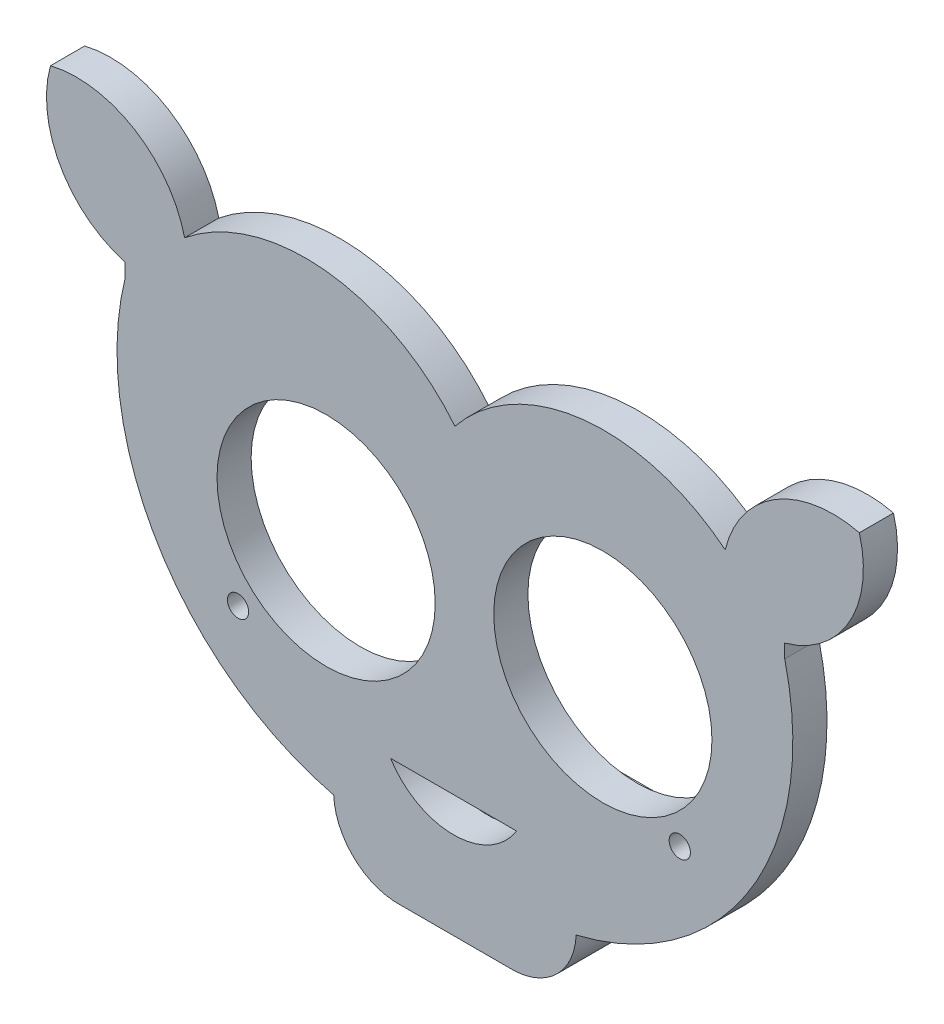
ISO-10303-21;
HEADER;
FILE_DESCRIPTION(('STEP AP214'),'2;1');
FILE_NAME('part.step','',(''),(''),'','','');
FILE_SCHEMA(('AUTOMOTIVE_DESIGN { 1 0 10303 214 1 1 1 1 }'));
ENDSEC;
DATA;
#1=APPLICATION_CONTEXT('core data for automotive mechanical design processes');
#2=APPLICATION_PROTOCOL_DEFINITION('international standard','automotive_design',2000,#1);
#3=PRODUCT_CONTEXT('',#1,'mechanical');
#4=PRODUCT('Part','Part','',(#3));
#5=PRODUCT_RELATED_PRODUCT_CATEGORY('part','',(#4));
#6=PRODUCT_DEFINITION_FORMATION('','',#4);
#7=PRODUCT_DEFINITION_CONTEXT('part definition',#1,'design');
#8=PRODUCT_DEFINITION('design','',#6,#7);
#9=PRODUCT_DEFINITION_SHAPE('','',#8);
#10=(LENGTH_UNIT() NAMED_UNIT(*) SI_UNIT(.MILLI.,.METRE.));
#11=(NAMED_UNIT(*) PLANE_ANGLE_UNIT() SI_UNIT($,.RADIAN.));
#12=(NAMED_UNIT(*) SI_UNIT($,.STERADIAN.) SOLID_ANGLE_UNIT());
#13=UNCERTAINTY_MEASURE_WITH_UNIT(LENGTH_MEASURE(1.E-05),#10,'distance_accuracy_value','');
#14=(GEOMETRIC_REPRESENTATION_CONTEXT(3) GLOBAL_UNCERTAINTY_ASSIGNED_CONTEXT((#13)) GLOBAL_UNIT_ASSIGNED_CONTEXT((#10,
#11,#12)) REPRESENTATION_CONTEXT('',''));
#15=CARTESIAN_POINT('',(0.,0.,0.));
#16=DIRECTION('',(0.,0.,1.));
#17=DIRECTION('',(1.,0.,0.));
#18=AXIS2_PLACEMENT_3D('',#15,#16,#17);
#19=CARTESIAN_POINT('',(38.3555523900781,3.96911641096236,0.));
#20=DIRECTION('',(0.,0.,1.));
#21=DIRECTION('',(1.,0.,0.));
#22=AXIS2_PLACEMENT_3D('',#19,#20,#21);
#23=PLANE('',#22);
#24=DIRECTION('',(-1.,0.,0.));
#25=VECTOR('',#24,1.);
#26=CARTESIAN_POINT('',(-19.2302630792207,-20.,0.));
#27=LINE('',#26,#25);
#28=CARTESIAN_POINT('',(37.0511121250854,-20.,0.));
#29=VERTEX_POINT('',#28);
#30=CARTESIAN_POINT('',(11.6300688555128,-20.,0.));
#31=VERTEX_POINT('',#30);
#32=EDGE_CURVE('E163',#29,#31,#27,.T.);
#33=ORIENTED_EDGE('',*,*,#32,.F.);
#34=CARTESIAN_POINT('',(29.3951473702594,5.56983304234548,0.));
#35=DIRECTION('',(0.,0.,1.));
#36=DIRECTION('',(1.,0.,0.));
#37=AXIS2_PLACEMENT_3D('',#34,#35,#36);
#38=CIRCLE('',#37,26.6913873401246);
#39=CARTESIAN_POINT('',(35.7289480452647,-20.3591686189192,0.));
#40=VERTEX_POINT('',#39);
#41=EDGE_CURVE('E217',#40,#29,#38,.T.);
#42=ORIENTED_EDGE('',*,*,#41,.F.);
#43=CARTESIAN_POINT('',(29.6583954974978,-20.0959204916808,0.));
#44=DIRECTION('',(0.,0.,1.));
#45=DIRECTION('',(-1.,0.,0.));
#46=AXIS2_PLACEMENT_3D('',#43,#44,#45);
#47=CIRCLE('',#46,6.07625771439082);
#48=CARTESIAN_POINT('',(29.3951473702594,-26.1664730394477,0.));
#49=VERTEX_POINT('',#48);
#50=EDGE_CURVE('E257',#49,#40,#47,.T.);
#51=ORIENTED_EDGE('',*,*,#50,.F.);
#52=DIRECTION('',(1.,0.,0.));
#53=VECTOR('',#52,1.);
#54=CARTESIAN_POINT('',(29.3951473702594,-26.1664730394477,0.));
#55=LINE('',#54,#53);
#56=CARTESIAN_POINT('',(19.2860336103388,-26.1664730394477,0.));
#57=VERTEX_POINT('',#56);
#58=EDGE_CURVE('E255',#57,#49,#55,.T.);
#59=ORIENTED_EDGE('',*,*,#58,.F.);
#60=CARTESIAN_POINT('',(19.0227854831005,-20.0959204916808,0.));
#61=DIRECTION('',(0.,0.,1.));
#62=DIRECTION('',(1.,0.,0.));
#63=AXIS2_PLACEMENT_3D('',#60,#61,#62);
#64=CIRCLE('',#63,6.07625771439082);
#65=CARTESIAN_POINT('',(12.9522329353335,-20.3591686189192,0.));
#66=VERTEX_POINT('',#65);
#67=EDGE_CURVE('E253',#66,#57,#64,.T.);
#68=ORIENTED_EDGE('',*,*,#67,.F.);
#69=CARTESIAN_POINT('',(19.2860336103388,5.56983304234548,0.));
#70=DIRECTION('',(0.,0.,1.));
#71=DIRECTION('',(-1.,0.,0.));
#72=AXIS2_PLACEMENT_3D('',#69,#70,#71);
#73=CIRCLE('',#72,26.6913873401246);
#74=EDGE_CURVE('E212',#31,#66,#73,.T.);
#75=ORIENTED_EDGE('',*,*,#74,.F.);
#76=EDGE_LOOP('',(#33,#42,#51,#59,#68,#75));
#77=FACE_BOUND('',#76,.T.);
#78=ADVANCED_FACE('F39',(#77),#23,.F.);
#79=CARTESIAN_POINT('',(38.3555523900781,3.96911641096236,15.));
#80=DIRECTION('',(0.,0.,-1.));
#81=DIRECTION('',(-1.,0.,0.));
#82=AXIS2_PLACEMENT_3D('',#79,#80,#81);
#83=CYLINDRICAL_SURFACE('',#82,18.0507581157901);
#84=DIRECTION('',(0.,0.,-1.));
#85=VECTOR('',#84,1.);
#86=CARTESIAN_POINT('',(49.7314352790014,17.9840783107417,15.));
#87=LINE('',#86,#85);
#88=CARTESIAN_POINT('',(49.7314352790014,17.9840783107417,15.));
#89=VERTEX_POINT('',#88);
#90=CARTESIAN_POINT('',(49.7314352790014,17.9840783107417,11.7916882033767));
#91=VERTEX_POINT('',#90);
#92=EDGE_CURVE('E251',#89,#91,#87,.T.);
#93=ORIENTED_EDGE('',*,*,#92,.T.);
#94=CARTESIAN_POINT('',(38.3555523900781,3.96911641096236,11.7916882033767));
#95=DIRECTION('',(0.,0.,1.));
#96=DIRECTION('',(1.,0.,0.));
#97=AXIS2_PLACEMENT_3D('',#94,#95,#96);
#98=CIRCLE('',#97,18.0507581157901);
#99=CARTESIAN_POINT('',(24.3405904902991,15.344999299886,11.7916882033767));
#100=VERTEX_POINT('',#99);
#101=EDGE_CURVE('E321',#91,#100,#98,.T.);
#102=ORIENTED_EDGE('',*,*,#101,.T.);
#103=DIRECTION('',(0.,0.,-1.));
#104=VECTOR('',#103,1.);
#105=CARTESIAN_POINT('',(24.3405904902991,15.344999299886,15.));
#106=LINE('',#105,#104);
#107=CARTESIAN_POINT('',(24.3405904902991,15.344999299886,15.));
#108=VERTEX_POINT('',#107);
#109=EDGE_CURVE('E11',#108,#100,#106,.T.);
#110=ORIENTED_EDGE('',*,*,#109,.F.);
#111=CARTESIAN_POINT('',(38.3555523900781,3.96911641096236,15.));
#112=DIRECTION('',(0.,0.,1.));
#113=DIRECTION('',(1.,0.,0.));
#114=AXIS2_PLACEMENT_3D('',#111,#112,#113);
#115=CIRCLE('',#114,18.0507581157901);
#116=EDGE_CURVE('E213',#89,#108,#115,.T.);
#117=ORIENTED_EDGE('',*,*,#116,.F.);
#118=EDGE_LOOP('',(#93,#102,#110,#117));
#119=FACE_BOUND('',#118,.T.);
#120=ADVANCED_FACE('F41',(#119),#83,.T.);
#121=CARTESIAN_POINT('',(10.3256285905201,3.96911641096236,15.));
#122=DIRECTION('',(0.,0.,-1.));
#123=DIRECTION('',(-1.,0.,0.));
#124=AXIS2_PLACEMENT_3D('',#121,#122,#123);
#125=CYLINDRICAL_SURFACE('',#124,18.0507581157901);
#126=ORIENTED_EDGE('',*,*,#109,.T.);
#127=CARTESIAN_POINT('',(10.3256285905201,3.96911641096236,11.7916882033767));
#128=DIRECTION('',(0.,0.,1.));
#129=DIRECTION('',(1.,0.,0.));
#130=AXIS2_PLACEMENT_3D('',#127,#128,#129);
#131=CIRCLE('',#130,18.0507581157901);
#132=CARTESIAN_POINT('',(-1.05025429840317,17.9840783107417,11.7916882033767));
#133=VERTEX_POINT('',#132);
#134=EDGE_CURVE('E324',#100,#133,#131,.T.);
#135=ORIENTED_EDGE('',*,*,#134,.T.);
#136=DIRECTION('',(0.,0.,-1.));
#137=VECTOR('',#136,1.);
#138=CARTESIAN_POINT('',(-1.05025429840317,17.9840783107417,15.));
#139=LINE('',#138,#137);
#140=CARTESIAN_POINT('',(-1.05025429840317,17.9840783107417,15.));
#141=VERTEX_POINT('',#140);
#142=EDGE_CURVE('E48',#141,#133,#139,.T.);
#143=ORIENTED_EDGE('',*,*,#142,.F.);
#144=CARTESIAN_POINT('',(10.3256285905201,3.96911641096236,15.));
#145=DIRECTION('',(0.,0.,1.));
#146=DIRECTION('',(-1.,0.,0.));
#147=AXIS2_PLACEMENT_3D('',#144,#145,#146);
#148=CIRCLE('',#147,18.0507581157901);
#149=EDGE_CURVE('E216',#108,#141,#148,.T.);
#150=ORIENTED_EDGE('',*,*,#149,.F.);
#151=EDGE_LOOP('',(#126,#135,#143,#150));
#152=FACE_BOUND('',#151,.T.);
#153=ADVANCED_FACE('F346',(#152),#125,.T.);
#154=CARTESIAN_POINT('',(-11.1993645312386,15.529105025536,15.));
#155=DIRECTION('',(0.,0.,-1.));
#156=DIRECTION('',(-1.,0.,0.));
#157=AXIS2_PLACEMENT_3D('',#154,#155,#156);
#158=CYLINDRICAL_SURFACE('',#157,10.4418069484797);
#159=ORIENTED_EDGE('',*,*,#142,.T.);
#160=CARTESIAN_POINT('',(-11.1993645312386,15.529105025536,11.7916882033767));
#161=DIRECTION('',(0.,0.,1.));
#162=DIRECTION('',(1.,0.,0.));
#163=AXIS2_PLACEMENT_3D('',#160,#161,#162);
#164=CIRCLE('',#163,10.4418069484797);
#165=CARTESIAN_POINT('',(-13.6543378164428,25.6782152583717,11.7916882033767));
#166=VERTEX_POINT('',#165);
#167=EDGE_CURVE('E327',#133,#166,#164,.T.);
#168=ORIENTED_EDGE('',*,*,#167,.T.);
#169=DIRECTION('',(0.,0.,-1.));
#170=VECTOR('',#169,1.);
#171=CARTESIAN_POINT('',(-13.6543378164428,25.6782152583717,15.));
#172=LINE('',#171,#170);
#173=CARTESIAN_POINT('',(-13.6543378164428,25.6782152583717,15.));
#174=VERTEX_POINT('',#173);
#175=EDGE_CURVE('E288',#174,#166,#172,.T.);
#176=ORIENTED_EDGE('',*,*,#175,.F.);
#177=CARTESIAN_POINT('',(-11.1993645312386,15.529105025536,15.));
#178=DIRECTION('',(0.,0.,1.));
#179=DIRECTION('',(-1.,0.,0.));
#180=AXIS2_PLACEMENT_3D('',#177,#178,#179);
#181=CIRCLE('',#180,10.4418069484797);
#182=EDGE_CURVE('E219',#141,#174,#181,.T.);
#183=ORIENTED_EDGE('',*,*,#182,.F.);
#184=EDGE_LOOP('',(#159,#168,#176,#183));
#185=FACE_BOUND('',#184,.T.);
#186=ADVANCED_FACE('F344',(#185),#158,.T.);
#187=CARTESIAN_POINT('',(-3.90661820989917,22.941865417345,15.));
#188=DIRECTION('',(0.,0.,-1.));
#189=DIRECTION('',(-1.,0.,0.));
#190=AXIS2_PLACEMENT_3D('',#187,#188,#189);
#191=CYLINDRICAL_SURFACE('',#190,10.1245072956802);
#192=ORIENTED_EDGE('',*,*,#175,.T.);
#193=CARTESIAN_POINT('',(-3.90661820989917,22.941865417345,11.7916882033767));
#194=DIRECTION('',(0.,0.,1.));
#195=DIRECTION('',(1.,0.,0.));
#196=AXIS2_PLACEMENT_3D('',#193,#194,#195);
#197=CIRCLE('',#196,10.1245072956802);
#198=CARTESIAN_POINT('',(-6.6429680509259,13.1941458108014,11.7916882033767));
#199=VERTEX_POINT('',#198);
#200=EDGE_CURVE('E185',#166,#199,#197,.T.);
#201=ORIENTED_EDGE('',*,*,#200,.T.);
#202=DIRECTION('',(0.,0.,-1.));
#203=VECTOR('',#202,1.);
#204=CARTESIAN_POINT('',(-6.6429680509259,13.1941458108014,15.));
#205=LINE('',#204,#203);
#206=CARTESIAN_POINT('',(-6.6429680509259,13.1941458108014,15.));
#207=VERTEX_POINT('',#206);
#208=EDGE_CURVE('E285',#207,#199,#205,.T.);
#209=ORIENTED_EDGE('',*,*,#208,.F.);
#210=CARTESIAN_POINT('',(-3.90661820989917,22.941865417345,15.));
#211=DIRECTION('',(0.,0.,1.));
#212=DIRECTION('',(-1.,0.,0.));
#213=AXIS2_PLACEMENT_3D('',#210,#211,#212);
#214=CIRCLE('',#213,10.1245072956802);
#215=EDGE_CURVE('E221',#174,#207,#214,.T.);
#216=ORIENTED_EDGE('',*,*,#215,.F.);
#217=EDGE_LOOP('',(#192,#201,#209,#216));
#218=FACE_BOUND('',#217,.T.);
#219=ADVANCED_FACE('F332',(#218),#191,.T.);
#220=CARTESIAN_POINT('',(-6.6429680509259,13.1941458108014,15.));
#221=DIRECTION('',(1.,0.,0.));
#222=DIRECTION('',(0.,0.,-1.));
#223=AXIS2_PLACEMENT_3D('',#220,#221,#222);
#224=PLANE('',#223);
#225=ORIENTED_EDGE('',*,*,#208,.T.);
#226=DIRECTION('',(0.,-1.,0.));
#227=VECTOR('',#226,1.);
#228=CARTESIAN_POINT('',(-6.6429680509259,13.1941458108014,11.7916882033767));
#229=LINE('',#228,#227);
#230=CARTESIAN_POINT('',(-6.6429680509259,11.9036337173506,11.7916882033767));
#231=VERTEX_POINT('',#230);
#232=EDGE_CURVE('E182',#199,#231,#229,.T.);
#233=ORIENTED_EDGE('',*,*,#232,.T.);
#234=DIRECTION('',(0.,0.,-1.));
#235=VECTOR('',#234,1.);
#236=CARTESIAN_POINT('',(-6.6429680509259,11.9036337173506,15.));
#237=LINE('',#236,#235);
#238=CARTESIAN_POINT('',(-6.6429680509259,11.9036337173506,15.));
#239=VERTEX_POINT('',#238);
#240=EDGE_CURVE('E181',#239,#231,#237,.T.);
#241=ORIENTED_EDGE('',*,*,#240,.F.);
#242=CARTESIAN_POINT('',(-6.6429680509259,13.1941458108014,15.));
#243=CARTESIAN_POINT('',(-6.6429680509259,11.9036337173506,15.));
#244=B_SPLINE_CURVE_WITH_KNOTS('',1,(#242,#243),.UNSPECIFIED.,.F.,.F.,(2,2),(0.,1.),.UNSPECIFIED.);
#245=EDGE_CURVE('E223',#207,#239,#244,.T.);
#246=ORIENTED_EDGE('',*,*,#245,.F.);
#247=EDGE_LOOP('',(#225,#233,#241,#246));
#248=FACE_BOUND('',#247,.T.);
#249=ADVANCED_FACE('F337',(#248),#224,.F.);
#250=CARTESIAN_POINT('',(19.2860336103388,5.56983304234548,15.));
#251=DIRECTION('',(0.,0.,-1.));
#252=DIRECTION('',(-1.,0.,0.));
#253=AXIS2_PLACEMENT_3D('',#250,#251,#252);
#254=CYLINDRICAL_SURFACE('',#253,26.6913873401246);
#255=ORIENTED_EDGE('',*,*,#240,.T.);
#256=CARTESIAN_POINT('',(19.2860336103388,5.56983304234548,11.7916882033767));
#257=DIRECTION('',(0.,0.,1.));
#258=DIRECTION('',(1.,0.,0.));
#259=AXIS2_PLACEMENT_3D('',#256,#257,#258);
#260=CIRCLE('',#259,26.6913873401246);
#261=CARTESIAN_POINT('',(11.6300688555128,-20.,11.7916882033767));
#262=VERTEX_POINT('',#261);
#263=EDGE_CURVE('E171',#231,#262,#260,.T.);
#264=ORIENTED_EDGE('',*,*,#263,.T.);
#265=DIRECTION('',(0.,0.,-1.));
#266=VECTOR('',#265,1.);
#267=CARTESIAN_POINT('',(11.6300688555128,-20.,15.));
#268=LINE('',#267,#266);
#269=EDGE_CURVE('E159',#31,#262,#268,.F.);
#270=ORIENTED_EDGE('',*,*,#269,.F.);
#271=ORIENTED_EDGE('',*,*,#74,.T.);
#272=DIRECTION('',(0.,0.,-1.));
#273=VECTOR('',#272,1.);
#274=CARTESIAN_POINT('',(12.9522329353335,-20.3591686189192,15.));
#275=LINE('',#274,#273);
#276=CARTESIAN_POINT('',(12.9522329353335,-20.3591686189192,15.));
#277=VERTEX_POINT('',#276);
#278=EDGE_CURVE('E281',#277,#66,#275,.T.);
#279=ORIENTED_EDGE('',*,*,#278,.F.);
#280=CARTESIAN_POINT('',(19.2860336103388,5.56983304234548,15.));
#281=DIRECTION('',(0.,0.,1.));
#282=DIRECTION('',(-1.,0.,0.));
#283=AXIS2_PLACEMENT_3D('',#280,#281,#282);
#284=CIRCLE('',#283,26.6913873401246);
#285=EDGE_CURVE('E227',#239,#277,#284,.T.);
#286=ORIENTED_EDGE('',*,*,#285,.F.);
#287=EDGE_LOOP('',(#255,#264,#270,#271,#279,#286));
#288=FACE_BOUND('',#287,.T.);
#289=ADVANCED_FACE('F178',(#288),#254,.T.);
#290=CARTESIAN_POINT('',(19.0227854831005,-20.0959204916808,15.));
#291=DIRECTION('',(0.,0.,-1.));
#292=DIRECTION('',(-1.,0.,0.));
#293=AXIS2_PLACEMENT_3D('',#290,#291,#292);
#294=CYLINDRICAL_SURFACE('',#293,6.07625771439082);
#295=ORIENTED_EDGE('',*,*,#67,.T.);
#296=DIRECTION('',(0.,0.,-1.));
#297=VECTOR('',#296,1.);
#298=CARTESIAN_POINT('',(19.2860336103388,-26.1664730394477,15.));
#299=LINE('',#298,#297);
#300=CARTESIAN_POINT('',(19.2860336103388,-26.1664730394477,15.));
#301=VERTEX_POINT('',#300);
#302=EDGE_CURVE('E278',#301,#57,#299,.T.);
#303=ORIENTED_EDGE('',*,*,#302,.F.);
#304=CARTESIAN_POINT('',(19.0227854831005,-20.0959204916808,15.));
#305=DIRECTION('',(0.,0.,1.));
#306=DIRECTION('',(1.,0.,0.));
#307=AXIS2_PLACEMENT_3D('',#304,#305,#306);
#308=CIRCLE('',#307,6.07625771439082);
#309=EDGE_CURVE('E232',#277,#301,#308,.T.);
#310=ORIENTED_EDGE('',*,*,#309,.F.);
#311=ORIENTED_EDGE('',*,*,#278,.T.);
#312=EDGE_LOOP('',(#295,#303,#310,#311));
#313=FACE_BOUND('',#312,.T.);
#314=ADVANCED_FACE('F374',(#313),#294,.T.);
#315=CARTESIAN_POINT('',(29.3951473702594,-26.1664730394477,15.));
#316=DIRECTION('',(0.,1.,0.));
#317=DIRECTION('',(0.,0.,1.));
#318=AXIS2_PLACEMENT_3D('',#315,#316,#317);
#319=PLANE('',#318);
#320=CARTESIAN_POINT('',(24.8310691421136,-26.1664730394477,5.82419793963385));
#321=DIRECTION('',(0.,1.,0.));
#322=DIRECTION('',(0.,0.,1.));
#323=AXIS2_PLACEMENT_3D('',#320,#321,#322);
#324=CIRCLE('',#323,1.5);
#325=CARTESIAN_POINT('',(24.8310691421136,-26.1664730394477,7.32419793963385));
#326=VERTEX_POINT('',#325);
#327=EDGE_CURVE('E175',#326,#326,#324,.T.);
#328=ORIENTED_EDGE('',*,*,#327,.T.);
#329=EDGE_LOOP('',(#328));
#330=FACE_BOUND('',#329,.T.);
#331=ORIENTED_EDGE('',*,*,#58,.T.);
#332=DIRECTION('',(0.,0.,-1.));
#333=VECTOR('',#332,1.);
#334=CARTESIAN_POINT('',(29.3951473702594,-26.1664730394477,15.));
#335=LINE('',#334,#333);
#336=CARTESIAN_POINT('',(29.3951473702594,-26.1664730394477,15.));
#337=VERTEX_POINT('',#336);
#338=EDGE_CURVE('E275',#337,#49,#335,.T.);
#339=ORIENTED_EDGE('',*,*,#338,.F.);
#340=DIRECTION('',(1.,0.,0.));
#341=VECTOR('',#340,1.);
#342=CARTESIAN_POINT('',(29.3951473702594,-26.1664730394477,15.));
#343=LINE('',#342,#341);
#344=EDGE_CURVE('E234',#301,#337,#343,.T.);
#345=ORIENTED_EDGE('',*,*,#344,.F.);
#346=ORIENTED_EDGE('',*,*,#302,.T.);
#347=EDGE_LOOP('',(#331,#339,#345,#346));
#348=FACE_BOUND('',#347,.T.);
#349=ADVANCED_FACE('F380',(#330,#348),#319,.F.);
#350=CARTESIAN_POINT('',(29.6583954974978,-20.0959204916808,15.));
#351=DIRECTION('',(0.,0.,-1.));
#352=DIRECTION('',(-1.,0.,0.));
#353=AXIS2_PLACEMENT_3D('',#350,#351,#352);
#354=CYLINDRICAL_SURFACE('',#353,6.07625771439082);
#355=ORIENTED_EDGE('',*,*,#50,.T.);
#356=DIRECTION('',(0.,0.,-1.));
#357=VECTOR('',#356,1.);
#358=CARTESIAN_POINT('',(35.7289480452647,-20.3591686189192,15.));
#359=LINE('',#358,#357);
#360=CARTESIAN_POINT('',(35.7289480452647,-20.3591686189192,15.));
#361=VERTEX_POINT('',#360);
#362=EDGE_CURVE('E272',#361,#40,#359,.T.);
#363=ORIENTED_EDGE('',*,*,#362,.F.);
#364=CARTESIAN_POINT('',(29.6583954974978,-20.0959204916808,15.));
#365=DIRECTION('',(0.,0.,1.));
#366=DIRECTION('',(-1.,0.,0.));
#367=AXIS2_PLACEMENT_3D('',#364,#365,#366);
#368=CIRCLE('',#367,6.07625771439082);
#369=EDGE_CURVE('E236',#337,#361,#368,.T.);
#370=ORIENTED_EDGE('',*,*,#369,.F.);
#371=ORIENTED_EDGE('',*,*,#338,.T.);
#372=EDGE_LOOP('',(#355,#363,#370,#371));
#373=FACE_BOUND('',#372,.T.);
#374=ADVANCED_FACE('F382',(#373),#354,.T.);
#375=CARTESIAN_POINT('',(29.3951473702594,5.56983304234548,15.));
#376=DIRECTION('',(0.,0.,-1.));
#377=DIRECTION('',(-1.,0.,0.));
#378=AXIS2_PLACEMENT_3D('',#375,#376,#377);
#379=CYLINDRICAL_SURFACE('',#378,26.6913873401246);
#380=DIRECTION('',(0.,0.,-1.));
#381=VECTOR('',#380,1.);
#382=CARTESIAN_POINT('',(37.0511121250854,-20.,15.));
#383=LINE('',#382,#381);
#384=CARTESIAN_POINT('',(37.0511121250854,-20.,11.7916882033767));
#385=VERTEX_POINT('',#384);
#386=EDGE_CURVE('E56',#385,#29,#383,.T.);
#387=ORIENTED_EDGE('',*,*,#386,.F.);
#388=CARTESIAN_POINT('',(29.3951473702594,5.56983304234548,11.7916882033767));
#389=DIRECTION('',(0.,0.,1.));
#390=DIRECTION('',(1.,0.,0.));
#391=AXIS2_PLACEMENT_3D('',#388,#389,#390);
#392=CIRCLE('',#391,26.6913873401246);
#393=CARTESIAN_POINT('',(55.3241490315241,11.9036337173506,11.7916882033767));
#394=VERTEX_POINT('',#393);
#395=EDGE_CURVE('E174',#385,#394,#392,.T.);
#396=ORIENTED_EDGE('',*,*,#395,.T.);
#397=DIRECTION('',(0.,0.,-1.));
#398=VECTOR('',#397,1.);
#399=CARTESIAN_POINT('',(55.3241490315241,11.9036337173506,15.));
#400=LINE('',#399,#398);
#401=CARTESIAN_POINT('',(55.3241490315241,11.9036337173506,15.));
#402=VERTEX_POINT('',#401);
#403=EDGE_CURVE('E269',#402,#394,#400,.T.);
#404=ORIENTED_EDGE('',*,*,#403,.F.);
#405=CARTESIAN_POINT('',(29.3951473702594,5.56983304234548,15.));
#406=DIRECTION('',(0.,0.,1.));
#407=DIRECTION('',(1.,0.,0.));
#408=AXIS2_PLACEMENT_3D('',#405,#406,#407);
#409=CIRCLE('',#408,26.6913873401246);
#410=EDGE_CURVE('E238',#361,#402,#409,.T.);
#411=ORIENTED_EDGE('',*,*,#410,.F.);
#412=ORIENTED_EDGE('',*,*,#362,.T.);
#413=ORIENTED_EDGE('',*,*,#41,.T.);
#414=EDGE_LOOP('',(#387,#396,#404,#411,#412,#413));
#415=FACE_BOUND('',#414,.T.);
#416=ADVANCED_FACE('F365',(#415),#379,.T.);
#417=CARTESIAN_POINT('',(55.3241490315241,11.9036337173506,15.));
#418=DIRECTION('',(-1.,0.,0.));
#419=DIRECTION('',(0.,0.,1.));
#420=AXIS2_PLACEMENT_3D('',#417,#418,#419);
#421=PLANE('',#420);
#422=ORIENTED_EDGE('',*,*,#403,.T.);
#423=DIRECTION('',(0.,1.,0.));
#424=VECTOR('',#423,1.);
#425=CARTESIAN_POINT('',(55.3241490315241,11.9036337173506,11.7916882033767));
#426=LINE('',#425,#424);
#427=CARTESIAN_POINT('',(55.3241490315241,13.1941458108014,11.7916882033767));
#428=VERTEX_POINT('',#427);
#429=EDGE_CURVE('E317',#394,#428,#426,.T.);
#430=ORIENTED_EDGE('',*,*,#429,.T.);
#431=DIRECTION('',(0.,0.,-1.));
#432=VECTOR('',#431,1.);
#433=CARTESIAN_POINT('',(55.3241490315241,13.1941458108014,15.));
#434=LINE('',#433,#432);
#435=CARTESIAN_POINT('',(55.3241490315241,13.1941458108014,15.));
#436=VERTEX_POINT('',#435);
#437=EDGE_CURVE('E266',#436,#428,#434,.T.);
#438=ORIENTED_EDGE('',*,*,#437,.F.);
#439=CARTESIAN_POINT('',(55.3241490315241,11.9036337173506,15.));
#440=CARTESIAN_POINT('',(55.3241490315241,13.1941458108014,15.));
#441=B_SPLINE_CURVE_WITH_KNOTS('',1,(#439,#440),.UNSPECIFIED.,.F.,.F.,(2,2),(0.,1.),.UNSPECIFIED.);
#442=EDGE_CURVE('E240',#402,#436,#441,.T.);
#443=ORIENTED_EDGE('',*,*,#442,.F.);
#444=EDGE_LOOP('',(#422,#430,#438,#443));
#445=FACE_BOUND('',#444,.T.);
#446=ADVANCED_FACE('F360',(#445),#421,.F.);
#447=CARTESIAN_POINT('',(52.5877991904974,22.941865417345,15.));
#448=DIRECTION('',(0.,0.,-1.));
#449=DIRECTION('',(-1.,0.,0.));
#450=AXIS2_PLACEMENT_3D('',#447,#448,#449);
#451=CYLINDRICAL_SURFACE('',#450,10.1245072956802);
#452=ORIENTED_EDGE('',*,*,#437,.T.);
#453=CARTESIAN_POINT('',(52.5877991904974,22.941865417345,11.7916882033767));
#454=DIRECTION('',(0.,0.,1.));
#455=DIRECTION('',(1.,0.,0.));
#456=AXIS2_PLACEMENT_3D('',#453,#454,#455);
#457=CIRCLE('',#456,10.1245072956802);
#458=CARTESIAN_POINT('',(62.335518797041,25.6782152583717,11.7916882033767));
#459=VERTEX_POINT('',#458);
#460=EDGE_CURVE('E314',#428,#459,#457,.T.);
#461=ORIENTED_EDGE('',*,*,#460,.T.);
#462=DIRECTION('',(0.,0.,-1.));
#463=VECTOR('',#462,1.);
#464=CARTESIAN_POINT('',(62.335518797041,25.6782152583717,15.));
#465=LINE('',#464,#463);
#466=CARTESIAN_POINT('',(62.335518797041,25.6782152583717,15.));
#467=VERTEX_POINT('',#466);
#468=EDGE_CURVE('E263',#467,#459,#465,.T.);
#469=ORIENTED_EDGE('',*,*,#468,.F.);
#470=CARTESIAN_POINT('',(52.5877991904974,22.941865417345,15.));
#471=DIRECTION('',(0.,0.,1.));
#472=DIRECTION('',(1.,0.,0.));
#473=AXIS2_PLACEMENT_3D('',#470,#471,#472);
#474=CIRCLE('',#473,10.1245072956802);
#475=EDGE_CURVE('E244',#436,#467,#474,.T.);
#476=ORIENTED_EDGE('',*,*,#475,.F.);
#477=EDGE_LOOP('',(#452,#461,#469,#476));
#478=FACE_BOUND('',#477,.T.);
#479=ADVANCED_FACE('F357',(#478),#451,.T.);
#480=CARTESIAN_POINT('',(59.8805455118368,15.529105025536,15.));
#481=DIRECTION('',(0.,0.,-1.));
#482=DIRECTION('',(-1.,0.,0.));
#483=AXIS2_PLACEMENT_3D('',#480,#481,#482);
#484=CYLINDRICAL_SURFACE('',#483,10.4418069484797);
#485=ORIENTED_EDGE('',*,*,#468,.T.);
#486=CARTESIAN_POINT('',(59.8805455118368,15.529105025536,11.7916882033767));
#487=DIRECTION('',(0.,0.,1.));
#488=DIRECTION('',(1.,0.,0.));
#489=AXIS2_PLACEMENT_3D('',#486,#487,#488);
#490=CIRCLE('',#489,10.4418069484797);
#491=EDGE_CURVE('E311',#459,#91,#490,.T.);
#492=ORIENTED_EDGE('',*,*,#491,.T.);
#493=ORIENTED_EDGE('',*,*,#92,.F.);
#494=CARTESIAN_POINT('',(59.8805455118368,15.529105025536,15.));
#495=DIRECTION('',(0.,0.,1.));
#496=DIRECTION('',(1.,0.,0.));
#497=AXIS2_PLACEMENT_3D('',#494,#495,#496);
#498=CIRCLE('',#497,10.4418069484797);
#499=EDGE_CURVE('E249',#467,#89,#498,.T.);
#500=ORIENTED_EDGE('',*,*,#499,.F.);
#501=EDGE_LOOP('',(#485,#492,#493,#500));
#502=FACE_BOUND('',#501,.T.);
#503=ADVANCED_FACE('F352',(#502),#484,.T.);
#504=CARTESIAN_POINT('',(38.3555523900781,3.96911641096236,15.));
#505=DIRECTION('',(0.,0.,1.));
#506=DIRECTION('',(1.,0.,0.));
#507=AXIS2_PLACEMENT_3D('',#504,#505,#506);
#508=PLANE('',#507);
#509=CARTESIAN_POINT('',(3.96629155188091,-9.46060072148775,15.));
#510=DIRECTION('',(0.,0.,1.));
#511=DIRECTION('',(1.,0.,0.));
#512=AXIS2_PLACEMENT_3D('',#509,#510,#511);
#513=CIRCLE('',#512,1.);
#514=CARTESIAN_POINT('',(4.96629155188091,-9.46060072148775,15.));
#515=VERTEX_POINT('',#514);
#516=EDGE_CURVE('E191',#515,#515,#513,.F.);
#517=ORIENTED_EDGE('',*,*,#516,.T.);
#518=EDGE_LOOP('',(#517));
#519=FACE_BOUND('',#518,.T.);
#520=CARTESIAN_POINT('',(45.4662915518809,-8.28163676906272,15.));
#521=DIRECTION('',(0.,0.,1.));
#522=DIRECTION('',(1.,0.,0.));
#523=AXIS2_PLACEMENT_3D('',#520,#521,#522);
#524=CIRCLE('',#523,0.999999999999998);
#525=CARTESIAN_POINT('',(46.4662915518809,-8.28163676906272,15.));
#526=VERTEX_POINT('',#525);
#527=EDGE_CURVE('E167',#526,#526,#524,.F.);
#528=ORIENTED_EDGE('',*,*,#527,.T.);
#529=EDGE_LOOP('',(#528));
#530=FACE_BOUND('',#529,.T.);
#531=DIRECTION('',(1.,0.,0.));
#532=VECTOR('',#531,1.);
#533=CARTESIAN_POINT('',(38.3555523900781,-14.6923730075089,15.));
#534=LINE('',#533,#532);
#535=CARTESIAN_POINT('',(18.2913537845872,-14.6923730075089,15.));
#536=VERTEX_POINT('',#535);
#537=CARTESIAN_POINT('',(30.1445878701038,-14.6923730075089,15.));
#538=VERTEX_POINT('',#537);
#539=EDGE_CURVE('E206',#536,#538,#534,.T.);
#540=ORIENTED_EDGE('',*,*,#539,.T.);
#541=CARTESIAN_POINT('',(24.2179708273455,-10.9626915926696,15.));
#542=DIRECTION('',(0.,0.,1.));
#543=DIRECTION('',(1.,0.,0.));
#544=AXIS2_PLACEMENT_3D('',#541,#542,#543);
#545=CIRCLE('',#544,7.00252190483621);
#546=EDGE_CURVE('E209',#538,#536,#545,.F.);
#547=ORIENTED_EDGE('',*,*,#546,.T.);
#548=EDGE_LOOP('',(#540,#547));
#549=FACE_BOUND('',#548,.T.);
#550=CARTESIAN_POINT('',(38.2374856250428,1.90215471221441,15.));
#551=DIRECTION('',(0.,0.,1.));
#552=DIRECTION('',(1.,0.,0.));
#553=AXIS2_PLACEMENT_3D('',#550,#551,#552);
#554=CIRCLE('',#553,10.25);
#555=CARTESIAN_POINT('',(48.4874856250428,1.90215471221441,15.));
#556=VERTEX_POINT('',#555);
#557=EDGE_CURVE('E203',#556,#556,#554,.F.);
#558=ORIENTED_EDGE('',*,*,#557,.T.);
#559=EDGE_LOOP('',(#558));
#560=FACE_BOUND('',#559,.T.);
#561=CARTESIAN_POINT('',(12.2374856250428,0.,15.));
#562=DIRECTION('',(0.,0.,1.));
#563=DIRECTION('',(1.,0.,0.));
#564=AXIS2_PLACEMENT_3D('',#561,#562,#563);
#565=CIRCLE('',#564,10.25);
#566=CARTESIAN_POINT('',(22.4874856250428,0.,15.));
#567=VERTEX_POINT('',#566);
#568=EDGE_CURVE('E200',#567,#567,#565,.F.);
#569=ORIENTED_EDGE('',*,*,#568,.T.);
#570=EDGE_LOOP('',(#569));
#571=FACE_BOUND('',#570,.T.);
#572=ORIENTED_EDGE('',*,*,#116,.T.);
#573=ORIENTED_EDGE('',*,*,#149,.T.);
#574=ORIENTED_EDGE('',*,*,#182,.T.);
#575=ORIENTED_EDGE('',*,*,#215,.T.);
#576=ORIENTED_EDGE('',*,*,#245,.T.);
#577=ORIENTED_EDGE('',*,*,#285,.T.);
#578=ORIENTED_EDGE('',*,*,#309,.T.);
#579=ORIENTED_EDGE('',*,*,#344,.T.);
#580=ORIENTED_EDGE('',*,*,#369,.T.);
#581=ORIENTED_EDGE('',*,*,#410,.T.);
#582=ORIENTED_EDGE('',*,*,#442,.T.);
#583=ORIENTED_EDGE('',*,*,#475,.T.);
#584=ORIENTED_EDGE('',*,*,#499,.T.);
#585=EDGE_LOOP('',(#572,#573,#574,#575,#576,#577,#578,#579,#580,#581,#582,#583,#584));
#586=FACE_BOUND('',#585,.T.);
#587=ADVANCED_FACE('F339',(#519,#530,#549,#560,#571,#586),#508,.T.);
#588=CARTESIAN_POINT('',(12.2374856250428,0.,39.));
#589=DIRECTION('',(0.,0.,-1.));
#590=DIRECTION('',(-1.,0.,0.));
#591=AXIS2_PLACEMENT_3D('',#588,#589,#590);
#592=CYLINDRICAL_SURFACE('',#591,10.25);
#593=CARTESIAN_POINT('',(12.2374856250428,0.,11.7916882033767));
#594=DIRECTION('',(0.,0.,1.));
#595=DIRECTION('',(1.,0.,0.));
#596=AXIS2_PLACEMENT_3D('',#593,#594,#595);
#597=CIRCLE('',#596,10.25);
#598=CARTESIAN_POINT('',(22.4874856250428,0.,11.7916882033767));
#599=VERTEX_POINT('',#598);
#600=EDGE_CURVE('E308',#599,#599,#597,.T.);
#601=ORIENTED_EDGE('',*,*,#600,.F.);
#602=EDGE_LOOP('',(#601));
#603=FACE_BOUND('',#602,.T.);
#604=ORIENTED_EDGE('',*,*,#568,.F.);
#605=EDGE_LOOP('',(#604));
#606=FACE_BOUND('',#605,.T.);
#607=ADVANCED_FACE('F427',(#603,#606),#592,.F.);
#608=CARTESIAN_POINT('',(38.2374856250428,1.90215471221441,39.));
#609=DIRECTION('',(0.,0.,-1.));
#610=DIRECTION('',(-1.,0.,0.));
#611=AXIS2_PLACEMENT_3D('',#608,#609,#610);
#612=CYLINDRICAL_SURFACE('',#611,10.25);
#613=CARTESIAN_POINT('',(38.2374856250428,1.90215471221441,11.7916882033767));
#614=DIRECTION('',(0.,0.,1.));
#615=DIRECTION('',(1.,0.,0.));
#616=AXIS2_PLACEMENT_3D('',#613,#614,#615);
#617=CIRCLE('',#616,10.25);
#618=CARTESIAN_POINT('',(48.4874856250428,1.90215471221441,11.7916882033767));
#619=VERTEX_POINT('',#618);
#620=EDGE_CURVE('E305',#619,#619,#617,.T.);
#621=ORIENTED_EDGE('',*,*,#620,.F.);
#622=EDGE_LOOP('',(#621));
#623=FACE_BOUND('',#622,.T.);
#624=ORIENTED_EDGE('',*,*,#557,.F.);
#625=EDGE_LOOP('',(#624));
#626=FACE_BOUND('',#625,.T.);
#627=ADVANCED_FACE('F431',(#623,#626),#612,.F.);
#628=CARTESIAN_POINT('',(24.2179708273455,-10.9626915926696,39.));
#629=DIRECTION('',(0.,0.,-1.));
#630=DIRECTION('',(-1.,0.,0.));
#631=AXIS2_PLACEMENT_3D('',#628,#629,#630);
#632=CYLINDRICAL_SURFACE('',#631,7.00252190483621);
#633=CARTESIAN_POINT('',(24.2179708273455,-10.9626915926696,11.7916882033767));
#634=DIRECTION('',(0.,0.,1.));
#635=DIRECTION('',(1.,0.,0.));
#636=AXIS2_PLACEMENT_3D('',#633,#634,#635);
#637=CIRCLE('',#636,7.00252190483621);
#638=CARTESIAN_POINT('',(18.2913537845872,-14.6923730075089,11.7916882033767));
#639=VERTEX_POINT('',#638);
#640=CARTESIAN_POINT('',(30.1445878701038,-14.6923730075089,11.7916882033767));
#641=VERTEX_POINT('',#640);
#642=EDGE_CURVE('E63',#639,#641,#637,.T.);
#643=ORIENTED_EDGE('',*,*,#642,.F.);
#644=DIRECTION('',(0.,0.,-1.));
#645=VECTOR('',#644,1.);
#646=CARTESIAN_POINT('',(18.2913537845872,-14.6923730075089,39.));
#647=LINE('',#646,#645);
#648=EDGE_CURVE('E197',#536,#639,#647,.T.);
#649=ORIENTED_EDGE('',*,*,#648,.F.);
#650=ORIENTED_EDGE('',*,*,#546,.F.);
#651=DIRECTION('',(0.,0.,-1.));
#652=VECTOR('',#651,1.);
#653=CARTESIAN_POINT('',(30.1445878701038,-14.6923730075089,39.));
#654=LINE('',#653,#652);
#655=EDGE_CURVE('E194',#538,#641,#654,.T.);
#656=ORIENTED_EDGE('',*,*,#655,.T.);
#657=EDGE_LOOP('',(#643,#649,#650,#656));
#658=FACE_BOUND('',#657,.T.);
#659=ADVANCED_FACE('F439',(#658),#632,.F.);
#660=CARTESIAN_POINT('',(18.2913537845872,-14.6923730075089,39.));
#661=DIRECTION('',(0.,-1.,0.));
#662=DIRECTION('',(0.,0.,-1.));
#663=AXIS2_PLACEMENT_3D('',#660,#661,#662);
#664=PLANE('',#663);
#665=DIRECTION('',(-1.,0.,0.));
#666=VECTOR('',#665,1.);
#667=CARTESIAN_POINT('',(18.2913537845872,-14.6923730075089,11.7916882033767));
#668=LINE('',#667,#666);
#669=EDGE_CURVE('E298',#641,#639,#668,.T.);
#670=ORIENTED_EDGE('',*,*,#669,.F.);
#671=ORIENTED_EDGE('',*,*,#655,.F.);
#672=ORIENTED_EDGE('',*,*,#539,.F.);
#673=ORIENTED_EDGE('',*,*,#648,.T.);
#674=EDGE_LOOP('',(#670,#671,#672,#673));
#675=FACE_BOUND('',#674,.T.);
#676=ADVANCED_FACE('F448',(#675),#664,.T.);
#677=CARTESIAN_POINT('',(45.4662915518809,-8.28163676906272,46.));
#678=DIRECTION('',(0.,0.,-1.));
#679=DIRECTION('',(-1.,0.,0.));
#680=AXIS2_PLACEMENT_3D('',#677,#678,#679);
#681=CYLINDRICAL_SURFACE('',#680,0.999999999999998);
#682=CARTESIAN_POINT('',(45.4662915518809,-8.28163676906272,11.7916882033767));
#683=DIRECTION('',(0.,0.,1.));
#684=DIRECTION('',(1.,0.,0.));
#685=AXIS2_PLACEMENT_3D('',#682,#683,#684);
#686=CIRCLE('',#685,0.999999999999998);
#687=CARTESIAN_POINT('',(46.4662915518809,-8.28163676906272,11.7916882033767));
#688=VERTEX_POINT('',#687);
#689=EDGE_CURVE('E294',#688,#688,#686,.T.);
#690=ORIENTED_EDGE('',*,*,#689,.F.);
#691=EDGE_LOOP('',(#690));
#692=FACE_BOUND('',#691,.T.);
#693=ORIENTED_EDGE('',*,*,#527,.F.);
#694=EDGE_LOOP('',(#693));
#695=FACE_BOUND('',#694,.T.);
#696=ADVANCED_FACE('F457',(#692,#695),#681,.F.);
#697=CARTESIAN_POINT('',(3.96629155188091,-9.46060072148775,46.));
#698=DIRECTION('',(0.,0.,-1.));
#699=DIRECTION('',(-1.,0.,0.));
#700=AXIS2_PLACEMENT_3D('',#697,#698,#699);
#701=CYLINDRICAL_SURFACE('',#700,1.);
#702=CARTESIAN_POINT('',(3.96629155188091,-9.46060072148775,11.7916882033767));
#703=DIRECTION('',(0.,0.,1.));
#704=DIRECTION('',(1.,0.,0.));
#705=AXIS2_PLACEMENT_3D('',#702,#703,#704);
#706=CIRCLE('',#705,1.);
#707=CARTESIAN_POINT('',(4.96629155188091,-9.46060072148775,11.7916882033767));
#708=VERTEX_POINT('',#707);
#709=EDGE_CURVE('E292',#708,#708,#706,.T.);
#710=ORIENTED_EDGE('',*,*,#709,.F.);
#711=EDGE_LOOP('',(#710));
#712=FACE_BOUND('',#711,.T.);
#713=ORIENTED_EDGE('',*,*,#516,.F.);
#714=EDGE_LOOP('',(#713));
#715=FACE_BOUND('',#714,.T.);
#716=ADVANCED_FACE('F466',(#712,#715),#701,.F.);
#717=CARTESIAN_POINT('',(0.,-20.,0.));
#718=DIRECTION('',(0.,1.,0.));
#719=DIRECTION('',(0.,0.,1.));
#720=AXIS2_PLACEMENT_3D('',#717,#718,#719);
#721=PLANE('',#720);
#722=CARTESIAN_POINT('',(24.8310691421136,-20.,5.82419793963385));
#723=DIRECTION('',(0.,1.,0.));
#724=DIRECTION('',(0.,0.,1.));
#725=AXIS2_PLACEMENT_3D('',#722,#723,#724);
#726=CIRCLE('',#725,1.5);
#727=CARTESIAN_POINT('',(24.8310691421136,-20.,7.32419793963385));
#728=VERTEX_POINT('',#727);
#729=EDGE_CURVE('E43',#728,#728,#726,.T.);
#730=ORIENTED_EDGE('',*,*,#729,.F.);
#731=EDGE_LOOP('',(#730));
#732=FACE_BOUND('',#731,.T.);
#733=ORIENTED_EDGE('',*,*,#269,.T.);
#734=DIRECTION('',(1.,0.,0.));
#735=VECTOR('',#734,1.);
#736=CARTESIAN_POINT('',(-19.2302630792207,-20.,11.7916882033767));
#737=LINE('',#736,#735);
#738=EDGE_CURVE('E162',#262,#385,#737,.T.);
#739=ORIENTED_EDGE('',*,*,#738,.T.);
#740=ORIENTED_EDGE('',*,*,#386,.T.);
#741=ORIENTED_EDGE('',*,*,#32,.T.);
#742=EDGE_LOOP('',(#733,#739,#740,#741));
#743=FACE_BOUND('',#742,.T.);
#744=ADVANCED_FACE('F161',(#732,#743),#721,.T.);
#745=CARTESIAN_POINT('',(-19.2302630792207,-20.,11.7916882033767));
#746=DIRECTION('',(0.,0.,1.));
#747=DIRECTION('',(1.,0.,0.));
#748=AXIS2_PLACEMENT_3D('',#745,#746,#747);
#749=PLANE('',#748);
#750=ORIENTED_EDGE('',*,*,#600,.T.);
#751=EDGE_LOOP('',(#750));
#752=FACE_BOUND('',#751,.T.);
#753=ORIENTED_EDGE('',*,*,#620,.T.);
#754=EDGE_LOOP('',(#753));
#755=FACE_BOUND('',#754,.T.);
#756=ORIENTED_EDGE('',*,*,#642,.T.);
#757=ORIENTED_EDGE('',*,*,#669,.T.);
#758=EDGE_LOOP('',(#756,#757));
#759=FACE_BOUND('',#758,.T.);
#760=ORIENTED_EDGE('',*,*,#689,.T.);
#761=EDGE_LOOP('',(#760));
#762=FACE_BOUND('',#761,.T.);
#763=ORIENTED_EDGE('',*,*,#709,.T.);
#764=EDGE_LOOP('',(#763));
#765=FACE_BOUND('',#764,.T.);
#766=ORIENTED_EDGE('',*,*,#232,.F.);
#767=ORIENTED_EDGE('',*,*,#200,.F.);
#768=ORIENTED_EDGE('',*,*,#167,.F.);
#769=ORIENTED_EDGE('',*,*,#134,.F.);
#770=ORIENTED_EDGE('',*,*,#101,.F.);
#771=ORIENTED_EDGE('',*,*,#491,.F.);
#772=ORIENTED_EDGE('',*,*,#460,.F.);
#773=ORIENTED_EDGE('',*,*,#429,.F.);
#774=ORIENTED_EDGE('',*,*,#395,.F.);
#775=ORIENTED_EDGE('',*,*,#738,.F.);
#776=ORIENTED_EDGE('',*,*,#263,.F.);
#777=EDGE_LOOP('',(#766,#767,#768,#769,#770,#771,#772,#773,#774,#775,#776));
#778=FACE_BOUND('',#777,.T.);
#779=ADVANCED_FACE('F170',(#752,#755,#759,#762,#765,#778),#749,.F.);
#780=CARTESIAN_POINT('',(24.8310691421136,-45.,5.82419793963385));
#781=DIRECTION('',(0.,1.,0.));
#782=DIRECTION('',(0.,0.,1.));
#783=AXIS2_PLACEMENT_3D('',#780,#781,#782);
#784=CYLINDRICAL_SURFACE('',#783,1.5);
#785=ORIENTED_EDGE('',*,*,#729,.T.);
#786=EDGE_LOOP('',(#785));
#787=FACE_BOUND('',#786,.T.);
#788=ORIENTED_EDGE('',*,*,#327,.F.);
#789=EDGE_LOOP('',(#788));
#790=FACE_BOUND('',#789,.T.);
#791=ADVANCED_FACE('F483',(#787,#790),#784,.F.);
#792=CLOSED_SHELL('',(#78,#120,#153,#186,#219,#249,#289,#314,#349,#374,#416,#446,#479,#503,#587,
#607,#627,#659,#676,#696,#716,#744,#779,#791));
#793=MANIFOLD_SOLID_BREP('B2',#792);
#794=ADVANCED_BREP_SHAPE_REPRESENTATION('',(#18,#793),#14);
#795=SHAPE_DEFINITION_REPRESENTATION(#9,#794);
ENDSEC;
END-ISO-10303-21;
